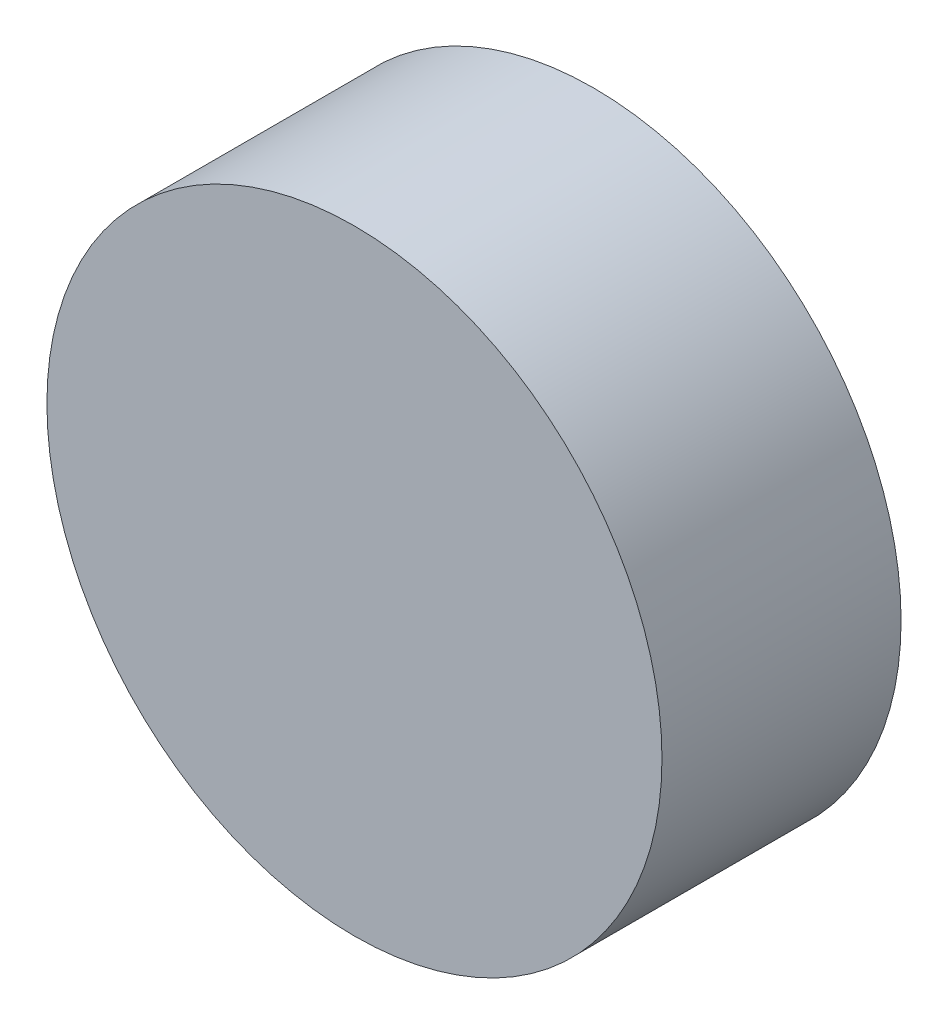
ISO-10303-21;
HEADER;
FILE_DESCRIPTION(('STEP AP214'),'2;1');
FILE_NAME('part.step','',(''),(''),'','','');
FILE_SCHEMA(('AUTOMOTIVE_DESIGN { 1 0 10303 214 1 1 1 1 }'));
ENDSEC;
DATA;
#1=APPLICATION_CONTEXT('core data for automotive mechanical design processes');
#2=APPLICATION_PROTOCOL_DEFINITION('international standard','automotive_design',2000,#1);
#3=PRODUCT_CONTEXT('',#1,'mechanical');
#4=PRODUCT('Part','Part','',(#3));
#5=PRODUCT_RELATED_PRODUCT_CATEGORY('part','',(#4));
#6=PRODUCT_DEFINITION_FORMATION('','',#4);
#7=PRODUCT_DEFINITION_CONTEXT('part definition',#1,'design');
#8=PRODUCT_DEFINITION('design','',#6,#7);
#9=PRODUCT_DEFINITION_SHAPE('','',#8);
#10=(LENGTH_UNIT() NAMED_UNIT(*) SI_UNIT(.MILLI.,.METRE.));
#11=(NAMED_UNIT(*) PLANE_ANGLE_UNIT() SI_UNIT($,.RADIAN.));
#12=(NAMED_UNIT(*) SI_UNIT($,.STERADIAN.) SOLID_ANGLE_UNIT());
#13=UNCERTAINTY_MEASURE_WITH_UNIT(LENGTH_MEASURE(1.E-05),#10,'distance_accuracy_value','');
#14=(GEOMETRIC_REPRESENTATION_CONTEXT(3) GLOBAL_UNCERTAINTY_ASSIGNED_CONTEXT((#13)) GLOBAL_UNIT_ASSIGNED_CONTEXT((#10,
#11,#12)) REPRESENTATION_CONTEXT('',''));
#15=CARTESIAN_POINT('',(0.,0.,0.));
#16=DIRECTION('',(0.,0.,1.));
#17=DIRECTION('',(1.,0.,0.));
#18=AXIS2_PLACEMENT_3D('',#15,#16,#17);
#19=CARTESIAN_POINT('',(51.993316759615,-18.053327970321,10.));
#20=DIRECTION('',(0.,0.,-1.));
#21=DIRECTION('',(-1.,0.,0.));
#22=AXIS2_PLACEMENT_3D('',#19,#20,#21);
#23=CYLINDRICAL_SURFACE('',#22,12.8619674869868);
#24=CARTESIAN_POINT('',(51.993316759615,-18.053327970321,10.));
#25=DIRECTION('',(0.,0.,1.));
#26=DIRECTION('',(1.,0.,0.));
#27=AXIS2_PLACEMENT_3D('',#24,#25,#26);
#28=CIRCLE('',#27,12.8619674869868);
#29=CARTESIAN_POINT('',(64.8552842466018,-18.053327970321,10.));
#30=VERTEX_POINT('',#29);
#31=EDGE_CURVE('E10',#30,#30,#28,.T.);
#32=ORIENTED_EDGE('',*,*,#31,.F.);
#33=EDGE_LOOP('',(#32));
#34=FACE_BOUND('',#33,.T.);
#35=CARTESIAN_POINT('',(51.993316759615,-18.053327970321,0.));
#36=DIRECTION('',(0.,0.,1.));
#37=DIRECTION('',(1.,0.,0.));
#38=AXIS2_PLACEMENT_3D('',#35,#36,#37);
#39=CIRCLE('',#38,12.8619674869868);
#40=CARTESIAN_POINT('',(64.8552842466018,-18.053327970321,0.));
#41=VERTEX_POINT('',#40);
#42=EDGE_CURVE('E34',#41,#41,#39,.T.);
#43=ORIENTED_EDGE('',*,*,#42,.T.);
#44=EDGE_LOOP('',(#43));
#45=FACE_BOUND('',#44,.T.);
#46=ADVANCED_FACE('F31',(#34,#45),#23,.T.);
#47=CARTESIAN_POINT('',(51.993316759615,-18.053327970321,10.));
#48=DIRECTION('',(0.,0.,1.));
#49=DIRECTION('',(1.,0.,0.));
#50=AXIS2_PLACEMENT_3D('',#47,#48,#49);
#51=PLANE('',#50);
#52=ORIENTED_EDGE('',*,*,#31,.T.);
#53=EDGE_LOOP('',(#52));
#54=FACE_BOUND('',#53,.T.);
#55=ADVANCED_FACE('F46',(#54),#51,.T.);
#56=CARTESIAN_POINT('',(51.993316759615,-18.053327970321,0.));
#57=DIRECTION('',(0.,0.,1.));
#58=DIRECTION('',(1.,0.,0.));
#59=AXIS2_PLACEMENT_3D('',#56,#57,#58);
#60=PLANE('',#59);
#61=ORIENTED_EDGE('',*,*,#42,.F.);
#62=EDGE_LOOP('',(#61));
#63=FACE_BOUND('',#62,.T.);
#64=ADVANCED_FACE('F44',(#63),#60,.F.);
#65=CLOSED_SHELL('',(#46,#55,#64));
#66=MANIFOLD_SOLID_BREP('B2',#65);
#67=ADVANCED_BREP_SHAPE_REPRESENTATION('',(#18,#66),#14);
#68=SHAPE_DEFINITION_REPRESENTATION(#9,#67);
ENDSEC;
END-ISO-10303-21;
